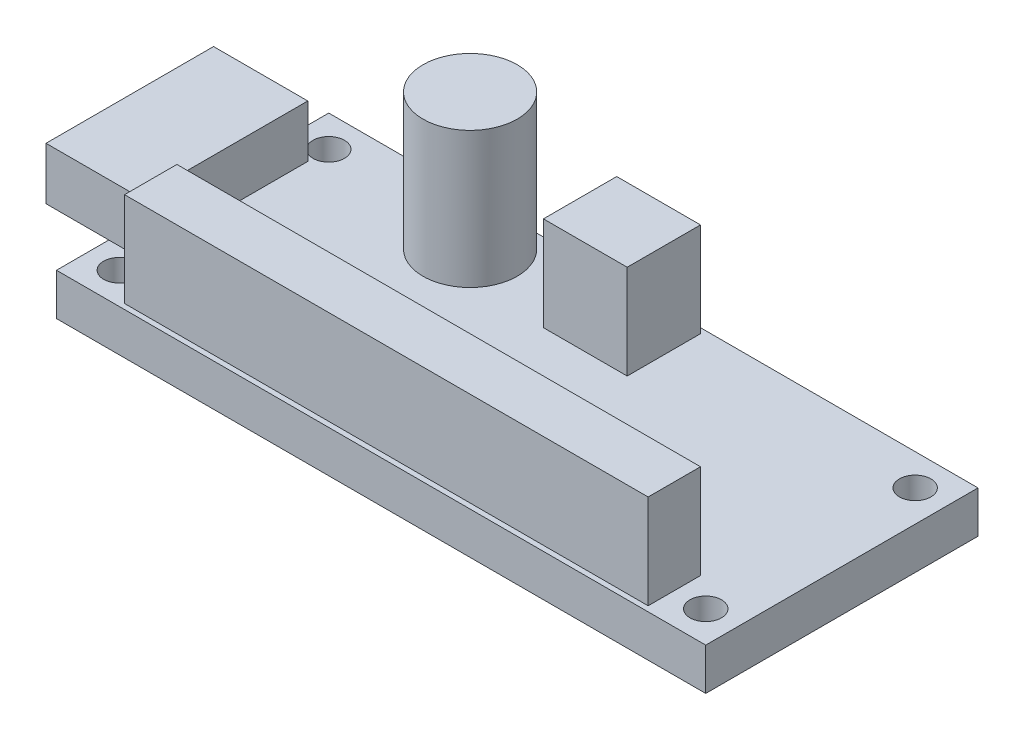
ISO-10303-21;
HEADER;
FILE_DESCRIPTION(('STEP AP214'),'2;1');
FILE_NAME('part.step','',(''),(''),'','','');
FILE_SCHEMA(('AUTOMOTIVE_DESIGN { 1 0 10303 214 1 1 1 1 }'));
ENDSEC;
DATA;
#1=APPLICATION_CONTEXT('core data for automotive mechanical design processes');
#2=APPLICATION_PROTOCOL_DEFINITION('international standard','automotive_design',2000,#1);
#3=PRODUCT_CONTEXT('',#1,'mechanical');
#4=PRODUCT('Part','Part','',(#3));
#5=PRODUCT_RELATED_PRODUCT_CATEGORY('part','',(#4));
#6=PRODUCT_DEFINITION_FORMATION('','',#4);
#7=PRODUCT_DEFINITION_CONTEXT('part definition',#1,'design');
#8=PRODUCT_DEFINITION('design','',#6,#7);
#9=PRODUCT_DEFINITION_SHAPE('','',#8);
#10=(LENGTH_UNIT() NAMED_UNIT(*) SI_UNIT(.MILLI.,.METRE.));
#11=(NAMED_UNIT(*) PLANE_ANGLE_UNIT() SI_UNIT($,.RADIAN.));
#12=(NAMED_UNIT(*) SI_UNIT($,.STERADIAN.) SOLID_ANGLE_UNIT());
#13=UNCERTAINTY_MEASURE_WITH_UNIT(LENGTH_MEASURE(1.E-05),#10,'distance_accuracy_value','');
#14=(GEOMETRIC_REPRESENTATION_CONTEXT(3) GLOBAL_UNCERTAINTY_ASSIGNED_CONTEXT((#13)) GLOBAL_UNIT_ASSIGNED_CONTEXT((#10,
#11,#12)) REPRESENTATION_CONTEXT('',''));
#15=CARTESIAN_POINT('',(0.,0.,0.));
#16=DIRECTION('',(0.,0.,1.));
#17=DIRECTION('',(1.,0.,0.));
#18=AXIS2_PLACEMENT_3D('',#15,#16,#17);
#19=CARTESIAN_POINT('',(0.,4.,0.));
#20=DIRECTION('',(0.,-1.,0.));
#21=DIRECTION('',(0.,0.,-1.));
#22=AXIS2_PLACEMENT_3D('',#19,#20,#21);
#23=PLANE('',#22);
#24=DIRECTION('',(0.,0.,1.));
#25=VECTOR('',#24,1.);
#26=CARTESIAN_POINT('',(28.,4.,-25.5));
#27=LINE('',#26,#25);
#28=CARTESIAN_POINT('',(28.,4.,-25.5));
#29=VERTEX_POINT('',#28);
#30=CARTESIAN_POINT('',(28.,4.,-18.5));
#31=VERTEX_POINT('',#30);
#32=EDGE_CURVE('E194',#29,#31,#27,.T.);
#33=ORIENTED_EDGE('',*,*,#32,.F.);
#34=DIRECTION('',(-1.,0.,0.));
#35=VECTOR('',#34,1.);
#36=CARTESIAN_POINT('',(28.,4.,-25.5));
#37=LINE('',#36,#35);
#38=CARTESIAN_POINT('',(36.,4.,-25.5));
#39=VERTEX_POINT('',#38);
#40=EDGE_CURVE('E210',#39,#29,#37,.T.);
#41=ORIENTED_EDGE('',*,*,#40,.F.);
#42=DIRECTION('',(0.,0.,-1.));
#43=VECTOR('',#42,1.);
#44=CARTESIAN_POINT('',(36.,4.,-25.5));
#45=LINE('',#44,#43);
#46=CARTESIAN_POINT('',(36.,4.,-18.5));
#47=VERTEX_POINT('',#46);
#48=EDGE_CURVE('E223',#47,#39,#45,.T.);
#49=ORIENTED_EDGE('',*,*,#48,.F.);
#50=DIRECTION('',(1.,0.,0.));
#51=VECTOR('',#50,1.);
#52=CARTESIAN_POINT('',(28.,4.,-18.5));
#53=LINE('',#52,#51);
#54=EDGE_CURVE('E199',#31,#47,#53,.T.);
#55=ORIENTED_EDGE('',*,*,#54,.F.);
#56=EDGE_LOOP('',(#33,#41,#49,#55));
#57=FACE_BOUND('',#56,.T.);
#58=CARTESIAN_POINT('',(3.,4.,-23.));
#59=DIRECTION('',(0.,1.,0.));
#60=DIRECTION('',(0.,0.,1.));
#61=AXIS2_PLACEMENT_3D('',#58,#59,#60);
#62=CIRCLE('',#61,1.5);
#63=CARTESIAN_POINT('',(3.,4.,-21.5));
#64=VERTEX_POINT('',#63);
#65=EDGE_CURVE('E303',#64,#64,#62,.T.);
#66=ORIENTED_EDGE('',*,*,#65,.F.);
#67=EDGE_LOOP('',(#66));
#68=FACE_BOUND('',#67,.T.);
#69=CARTESIAN_POINT('',(3.,4.,-2.99999999999999));
#70=DIRECTION('',(0.,1.,0.));
#71=DIRECTION('',(0.,0.,1.));
#72=AXIS2_PLACEMENT_3D('',#69,#70,#71);
#73=CIRCLE('',#72,1.5);
#74=CARTESIAN_POINT('',(3.,4.,-1.49999999999999));
#75=VERTEX_POINT('',#74);
#76=EDGE_CURVE('E299',#75,#75,#73,.T.);
#77=ORIENTED_EDGE('',*,*,#76,.F.);
#78=EDGE_LOOP('',(#77));
#79=FACE_BOUND('',#78,.T.);
#80=CARTESIAN_POINT('',(59.,4.,-3.));
#81=DIRECTION('',(0.,1.,0.));
#82=DIRECTION('',(0.,0.,1.));
#83=AXIS2_PLACEMENT_3D('',#80,#81,#82);
#84=CIRCLE('',#83,1.5);
#85=CARTESIAN_POINT('',(59.,4.,-1.5));
#86=VERTEX_POINT('',#85);
#87=EDGE_CURVE('E308',#86,#86,#84,.T.);
#88=ORIENTED_EDGE('',*,*,#87,.F.);
#89=EDGE_LOOP('',(#88));
#90=FACE_BOUND('',#89,.T.);
#91=CARTESIAN_POINT('',(59.,4.,-23.));
#92=DIRECTION('',(0.,1.,0.));
#93=DIRECTION('',(0.,0.,1.));
#94=AXIS2_PLACEMENT_3D('',#91,#92,#93);
#95=CIRCLE('',#94,1.5);
#96=CARTESIAN_POINT('',(59.,4.,-21.5));
#97=VERTEX_POINT('',#96);
#98=EDGE_CURVE('E316',#97,#97,#95,.T.);
#99=ORIENTED_EDGE('',*,*,#98,.F.);
#100=EDGE_LOOP('',(#99));
#101=FACE_BOUND('',#100,.T.);
#102=DIRECTION('',(0.,0.,1.));
#103=VECTOR('',#102,1.);
#104=CARTESIAN_POINT('',(6.,4.,-0.5));
#105=LINE('',#104,#103);
#106=CARTESIAN_POINT('',(6.,4.,-5.5));
#107=VERTEX_POINT('',#106);
#108=CARTESIAN_POINT('',(6.,4.,-0.5));
#109=VERTEX_POINT('',#108);
#110=EDGE_CURVE('E250',#107,#109,#105,.T.);
#111=ORIENTED_EDGE('',*,*,#110,.F.);
#112=DIRECTION('',(-1.,0.,0.));
#113=VECTOR('',#112,1.);
#114=CARTESIAN_POINT('',(6.,4.,-5.5));
#115=LINE('',#114,#113);
#116=CARTESIAN_POINT('',(56.,4.,-5.5));
#117=VERTEX_POINT('',#116);
#118=EDGE_CURVE('E259',#117,#107,#115,.T.);
#119=ORIENTED_EDGE('',*,*,#118,.F.);
#120=DIRECTION('',(0.,0.,-1.));
#121=VECTOR('',#120,1.);
#122=CARTESIAN_POINT('',(56.,4.,-0.5));
#123=LINE('',#122,#121);
#124=CARTESIAN_POINT('',(56.,4.,-0.5));
#125=VERTEX_POINT('',#124);
#126=EDGE_CURVE('E276',#125,#117,#123,.T.);
#127=ORIENTED_EDGE('',*,*,#126,.F.);
#128=DIRECTION('',(1.,0.,0.));
#129=VECTOR('',#128,1.);
#130=CARTESIAN_POINT('',(6.,4.,-0.5));
#131=LINE('',#130,#129);
#132=EDGE_CURVE('E272',#109,#125,#131,.T.);
#133=ORIENTED_EDGE('',*,*,#132,.F.);
#134=EDGE_LOOP('',(#111,#119,#127,#133));
#135=FACE_BOUND('',#134,.T.);
#136=DIRECTION('',(1.,0.,0.));
#137=VECTOR('',#136,1.);
#138=CARTESIAN_POINT('',(-6.,4.,-5.));
#139=LINE('',#138,#137);
#140=CARTESIAN_POINT('',(0.,4.,-5.));
#141=VERTEX_POINT('',#140);
#142=CARTESIAN_POINT('',(3.,4.,-5.));
#143=VERTEX_POINT('',#142);
#144=EDGE_CURVE('E412',#141,#143,#139,.T.);
#145=ORIENTED_EDGE('',*,*,#144,.F.);
#146=DIRECTION('',(0.,0.,1.));
#147=VECTOR('',#146,1.);
#148=CARTESIAN_POINT('',(0.,4.,0.));
#149=LINE('',#148,#147);
#150=CARTESIAN_POINT('',(0.,4.,0.));
#151=VERTEX_POINT('',#150);
#152=EDGE_CURVE('E336',#141,#151,#149,.T.);
#153=ORIENTED_EDGE('',*,*,#152,.T.);
#154=DIRECTION('',(1.,0.,0.));
#155=VECTOR('',#154,1.);
#156=CARTESIAN_POINT('',(0.,4.,0.));
#157=LINE('',#156,#155);
#158=CARTESIAN_POINT('',(62.,4.,0.));
#159=VERTEX_POINT('',#158);
#160=EDGE_CURVE('E334',#151,#159,#157,.T.);
#161=ORIENTED_EDGE('',*,*,#160,.T.);
#162=DIRECTION('',(0.,0.,-1.));
#163=VECTOR('',#162,1.);
#164=CARTESIAN_POINT('',(62.,4.,0.));
#165=LINE('',#164,#163);
#166=CARTESIAN_POINT('',(62.,4.,-26.));
#167=VERTEX_POINT('',#166);
#168=EDGE_CURVE('E339',#159,#167,#165,.T.);
#169=ORIENTED_EDGE('',*,*,#168,.T.);
#170=DIRECTION('',(-1.,0.,0.));
#171=VECTOR('',#170,1.);
#172=CARTESIAN_POINT('',(0.,4.,-26.));
#173=LINE('',#172,#171);
#174=CARTESIAN_POINT('',(18.,4.,-26.));
#175=VERTEX_POINT('',#174);
#176=EDGE_CURVE('E343',#167,#175,#173,.T.);
#177=ORIENTED_EDGE('',*,*,#176,.T.);
#178=CARTESIAN_POINT('',(18.,4.,-21.5));
#179=DIRECTION('',(0.,1.,0.));
#180=DIRECTION('',(0.,0.,1.));
#181=AXIS2_PLACEMENT_3D('',#178,#179,#180);
#182=CIRCLE('',#181,4.5);
#183=EDGE_CURVE('E245',#175,#175,#182,.T.);
#184=ORIENTED_EDGE('',*,*,#183,.F.);
#185=CARTESIAN_POINT('',(0.,4.,-26.));
#186=VERTEX_POINT('',#185);
#187=EDGE_CURVE('E342',#175,#186,#173,.T.);
#188=ORIENTED_EDGE('',*,*,#187,.T.);
#189=CARTESIAN_POINT('',(0.,4.,-21.));
#190=VERTEX_POINT('',#189);
#191=EDGE_CURVE('E331',#186,#190,#149,.T.);
#192=ORIENTED_EDGE('',*,*,#191,.T.);
#193=DIRECTION('',(-1.,0.,0.));
#194=VECTOR('',#193,1.);
#195=CARTESIAN_POINT('',(-6.,4.,-21.));
#196=LINE('',#195,#194);
#197=CARTESIAN_POINT('',(3.,4.,-21.));
#198=VERTEX_POINT('',#197);
#199=EDGE_CURVE('E64',#198,#190,#196,.T.);
#200=ORIENTED_EDGE('',*,*,#199,.F.);
#201=DIRECTION('',(0.,0.,-1.));
#202=VECTOR('',#201,1.);
#203=CARTESIAN_POINT('',(3.,4.,-21.));
#204=LINE('',#203,#202);
#205=EDGE_CURVE('E59',#143,#198,#204,.T.);
#206=ORIENTED_EDGE('',*,*,#205,.F.);
#207=EDGE_LOOP('',(#145,#153,#161,#169,#177,#184,#188,#192,#200,#206));
#208=FACE_BOUND('',#207,.T.);
#209=ADVANCED_FACE('F43',(#57,#68,#79,#90,#101,#135,#208),#23,.F.);
#210=CARTESIAN_POINT('',(0.,4.,0.));
#211=DIRECTION('',(1.,0.,0.));
#212=DIRECTION('',(0.,0.,-1.));
#213=AXIS2_PLACEMENT_3D('',#210,#211,#212);
#214=PLANE('',#213);
#215=DIRECTION('',(0.,0.,1.));
#216=VECTOR('',#215,1.);
#217=CARTESIAN_POINT('',(0.,0.,0.));
#218=LINE('',#217,#216);
#219=CARTESIAN_POINT('',(0.,0.,-26.));
#220=VERTEX_POINT('',#219);
#221=CARTESIAN_POINT('',(0.,0.,0.));
#222=VERTEX_POINT('',#221);
#223=EDGE_CURVE('E327',#220,#222,#218,.T.);
#224=ORIENTED_EDGE('',*,*,#223,.T.);
#225=DIRECTION('',(0.,-1.,0.));
#226=VECTOR('',#225,1.);
#227=CARTESIAN_POINT('',(0.,4.,0.));
#228=LINE('',#227,#226);
#229=EDGE_CURVE('E11',#151,#222,#228,.T.);
#230=ORIENTED_EDGE('',*,*,#229,.F.);
#231=ORIENTED_EDGE('',*,*,#152,.F.);
#232=EDGE_CURVE('E335',#190,#141,#149,.T.);
#233=ORIENTED_EDGE('',*,*,#232,.F.);
#234=ORIENTED_EDGE('',*,*,#191,.F.);
#235=DIRECTION('',(0.,-1.,0.));
#236=VECTOR('',#235,1.);
#237=CARTESIAN_POINT('',(0.,4.,-26.));
#238=LINE('',#237,#236);
#239=EDGE_CURVE('E346',#186,#220,#238,.T.);
#240=ORIENTED_EDGE('',*,*,#239,.T.);
#241=EDGE_LOOP('',(#224,#230,#231,#233,#234,#240));
#242=FACE_BOUND('',#241,.T.);
#243=ADVANCED_FACE('F45',(#242),#214,.F.);
#244=CARTESIAN_POINT('',(0.,4.,0.));
#245=DIRECTION('',(0.,0.,-1.));
#246=DIRECTION('',(-1.,0.,0.));
#247=AXIS2_PLACEMENT_3D('',#244,#245,#246);
#248=PLANE('',#247);
#249=DIRECTION('',(1.,0.,0.));
#250=VECTOR('',#249,1.);
#251=CARTESIAN_POINT('',(0.,0.,0.));
#252=LINE('',#251,#250);
#253=CARTESIAN_POINT('',(62.,0.,0.));
#254=VERTEX_POINT('',#253);
#255=EDGE_CURVE('E350',#222,#254,#252,.T.);
#256=ORIENTED_EDGE('',*,*,#255,.T.);
#257=DIRECTION('',(0.,-1.,0.));
#258=VECTOR('',#257,1.);
#259=CARTESIAN_POINT('',(62.,4.,0.));
#260=LINE('',#259,#258);
#261=EDGE_CURVE('E52',#159,#254,#260,.T.);
#262=ORIENTED_EDGE('',*,*,#261,.F.);
#263=ORIENTED_EDGE('',*,*,#160,.F.);
#264=ORIENTED_EDGE('',*,*,#229,.T.);
#265=EDGE_LOOP('',(#256,#262,#263,#264));
#266=FACE_BOUND('',#265,.T.);
#267=ADVANCED_FACE('F433',(#266),#248,.F.);
#268=CARTESIAN_POINT('',(62.,4.,0.));
#269=DIRECTION('',(-1.,0.,0.));
#270=DIRECTION('',(0.,0.,1.));
#271=AXIS2_PLACEMENT_3D('',#268,#269,#270);
#272=PLANE('',#271);
#273=DIRECTION('',(0.,0.,-1.));
#274=VECTOR('',#273,1.);
#275=CARTESIAN_POINT('',(62.,0.,0.));
#276=LINE('',#275,#274);
#277=CARTESIAN_POINT('',(62.,0.,-26.));
#278=VERTEX_POINT('',#277);
#279=EDGE_CURVE('E353',#254,#278,#276,.T.);
#280=ORIENTED_EDGE('',*,*,#279,.T.);
#281=DIRECTION('',(0.,-1.,0.));
#282=VECTOR('',#281,1.);
#283=CARTESIAN_POINT('',(62.,4.,-26.));
#284=LINE('',#283,#282);
#285=EDGE_CURVE('E362',#167,#278,#284,.T.);
#286=ORIENTED_EDGE('',*,*,#285,.F.);
#287=ORIENTED_EDGE('',*,*,#168,.F.);
#288=ORIENTED_EDGE('',*,*,#261,.T.);
#289=EDGE_LOOP('',(#280,#286,#287,#288));
#290=FACE_BOUND('',#289,.T.);
#291=ADVANCED_FACE('F371',(#290),#272,.F.);
#292=CARTESIAN_POINT('',(0.,4.,-26.));
#293=DIRECTION('',(0.,0.,1.));
#294=DIRECTION('',(1.,0.,0.));
#295=AXIS2_PLACEMENT_3D('',#292,#293,#294);
#296=PLANE('',#295);
#297=DIRECTION('',(-1.,0.,0.));
#298=VECTOR('',#297,1.);
#299=CARTESIAN_POINT('',(0.,0.,-26.));
#300=LINE('',#299,#298);
#301=EDGE_CURVE('E356',#278,#220,#300,.T.);
#302=ORIENTED_EDGE('',*,*,#301,.T.);
#303=ORIENTED_EDGE('',*,*,#239,.F.);
#304=ORIENTED_EDGE('',*,*,#187,.F.);
#305=ORIENTED_EDGE('',*,*,#176,.F.);
#306=ORIENTED_EDGE('',*,*,#285,.T.);
#307=EDGE_LOOP('',(#302,#303,#304,#305,#306));
#308=FACE_BOUND('',#307,.T.);
#309=ADVANCED_FACE('F381',(#308),#296,.F.);
#310=CARTESIAN_POINT('',(0.,0.,0.));
#311=DIRECTION('',(0.,-1.,0.));
#312=DIRECTION('',(0.,0.,-1.));
#313=AXIS2_PLACEMENT_3D('',#310,#311,#312);
#314=PLANE('',#313);
#315=CARTESIAN_POINT('',(59.,0.,-23.));
#316=DIRECTION('',(0.,1.,0.));
#317=DIRECTION('',(0.,0.,1.));
#318=AXIS2_PLACEMENT_3D('',#315,#316,#317);
#319=CIRCLE('',#318,1.5);
#320=CARTESIAN_POINT('',(59.,0.,-21.5));
#321=VERTEX_POINT('',#320);
#322=EDGE_CURVE('E298',#321,#321,#319,.T.);
#323=ORIENTED_EDGE('',*,*,#322,.T.);
#324=EDGE_LOOP('',(#323));
#325=FACE_BOUND('',#324,.T.);
#326=CARTESIAN_POINT('',(59.,0.,-3.));
#327=DIRECTION('',(0.,1.,0.));
#328=DIRECTION('',(0.,0.,1.));
#329=AXIS2_PLACEMENT_3D('',#326,#327,#328);
#330=CIRCLE('',#329,1.5);
#331=CARTESIAN_POINT('',(59.,0.,-1.5));
#332=VERTEX_POINT('',#331);
#333=EDGE_CURVE('E312',#332,#332,#330,.T.);
#334=ORIENTED_EDGE('',*,*,#333,.T.);
#335=EDGE_LOOP('',(#334));
#336=FACE_BOUND('',#335,.T.);
#337=CARTESIAN_POINT('',(3.,0.,-2.99999999999999));
#338=DIRECTION('',(0.,1.,0.));
#339=DIRECTION('',(0.,0.,1.));
#340=AXIS2_PLACEMENT_3D('',#337,#338,#339);
#341=CIRCLE('',#340,1.5);
#342=CARTESIAN_POINT('',(3.,0.,-1.49999999999999));
#343=VERTEX_POINT('',#342);
#344=EDGE_CURVE('E304',#343,#343,#341,.T.);
#345=ORIENTED_EDGE('',*,*,#344,.T.);
#346=EDGE_LOOP('',(#345));
#347=FACE_BOUND('',#346,.T.);
#348=CARTESIAN_POINT('',(3.,0.,-23.));
#349=DIRECTION('',(0.,1.,0.));
#350=DIRECTION('',(0.,0.,1.));
#351=AXIS2_PLACEMENT_3D('',#348,#349,#350);
#352=CIRCLE('',#351,1.5);
#353=CARTESIAN_POINT('',(3.,0.,-21.5));
#354=VERTEX_POINT('',#353);
#355=EDGE_CURVE('E323',#354,#354,#352,.T.);
#356=ORIENTED_EDGE('',*,*,#355,.T.);
#357=EDGE_LOOP('',(#356));
#358=FACE_BOUND('',#357,.T.);
#359=ORIENTED_EDGE('',*,*,#223,.F.);
#360=ORIENTED_EDGE('',*,*,#301,.F.);
#361=ORIENTED_EDGE('',*,*,#279,.F.);
#362=ORIENTED_EDGE('',*,*,#255,.F.);
#363=EDGE_LOOP('',(#359,#360,#361,#362));
#364=FACE_BOUND('',#363,.T.);
#365=ADVANCED_FACE('F378',(#325,#336,#347,#358,#364),#314,.T.);
#366=CARTESIAN_POINT('',(3.,0.,-23.));
#367=DIRECTION('',(0.,1.,0.));
#368=DIRECTION('',(0.,0.,1.));
#369=AXIS2_PLACEMENT_3D('',#366,#367,#368);
#370=CYLINDRICAL_SURFACE('',#369,1.5);
#371=ORIENTED_EDGE('',*,*,#355,.F.);
#372=EDGE_LOOP('',(#371));
#373=FACE_BOUND('',#372,.T.);
#374=ORIENTED_EDGE('',*,*,#65,.T.);
#375=EDGE_LOOP('',(#374));
#376=FACE_BOUND('',#375,.T.);
#377=ADVANCED_FACE('F437',(#373,#376),#370,.F.);
#378=CARTESIAN_POINT('',(3.,0.,-2.99999999999999));
#379=DIRECTION('',(0.,1.,0.));
#380=DIRECTION('',(0.,0.,1.));
#381=AXIS2_PLACEMENT_3D('',#378,#379,#380);
#382=CYLINDRICAL_SURFACE('',#381,1.5);
#383=ORIENTED_EDGE('',*,*,#344,.F.);
#384=EDGE_LOOP('',(#383));
#385=FACE_BOUND('',#384,.T.);
#386=ORIENTED_EDGE('',*,*,#76,.T.);
#387=EDGE_LOOP('',(#386));
#388=FACE_BOUND('',#387,.T.);
#389=ADVANCED_FACE('F487',(#385,#388),#382,.F.);
#390=CARTESIAN_POINT('',(59.,0.,-3.));
#391=DIRECTION('',(0.,1.,0.));
#392=DIRECTION('',(0.,0.,1.));
#393=AXIS2_PLACEMENT_3D('',#390,#391,#392);
#394=CYLINDRICAL_SURFACE('',#393,1.5);
#395=ORIENTED_EDGE('',*,*,#333,.F.);
#396=EDGE_LOOP('',(#395));
#397=FACE_BOUND('',#396,.T.);
#398=ORIENTED_EDGE('',*,*,#87,.T.);
#399=EDGE_LOOP('',(#398));
#400=FACE_BOUND('',#399,.T.);
#401=ADVANCED_FACE('F490',(#397,#400),#394,.F.);
#402=CARTESIAN_POINT('',(59.,0.,-23.));
#403=DIRECTION('',(0.,1.,0.));
#404=DIRECTION('',(0.,0.,1.));
#405=AXIS2_PLACEMENT_3D('',#402,#403,#404);
#406=CYLINDRICAL_SURFACE('',#405,1.5);
#407=ORIENTED_EDGE('',*,*,#322,.F.);
#408=EDGE_LOOP('',(#407));
#409=FACE_BOUND('',#408,.T.);
#410=ORIENTED_EDGE('',*,*,#98,.T.);
#411=EDGE_LOOP('',(#410));
#412=FACE_BOUND('',#411,.T.);
#413=ADVANCED_FACE('F485',(#409,#412),#406,.F.);
#414=CARTESIAN_POINT('',(6.,13.,-0.5));
#415=DIRECTION('',(1.,0.,0.));
#416=DIRECTION('',(0.,0.,-1.));
#417=AXIS2_PLACEMENT_3D('',#414,#415,#416);
#418=PLANE('',#417);
#419=ORIENTED_EDGE('',*,*,#110,.T.);
#420=DIRECTION('',(0.,-1.,0.));
#421=VECTOR('',#420,1.);
#422=CARTESIAN_POINT('',(6.,13.,-0.5));
#423=LINE('',#422,#421);
#424=CARTESIAN_POINT('',(6.,13.,-0.5));
#425=VERTEX_POINT('',#424);
#426=EDGE_CURVE('E294',#425,#109,#423,.T.);
#427=ORIENTED_EDGE('',*,*,#426,.F.);
#428=DIRECTION('',(0.,0.,1.));
#429=VECTOR('',#428,1.);
#430=CARTESIAN_POINT('',(6.,13.,-0.5));
#431=LINE('',#430,#429);
#432=CARTESIAN_POINT('',(6.,13.,-5.5));
#433=VERTEX_POINT('',#432);
#434=EDGE_CURVE('E254',#433,#425,#431,.T.);
#435=ORIENTED_EDGE('',*,*,#434,.F.);
#436=DIRECTION('',(0.,-1.,0.));
#437=VECTOR('',#436,1.);
#438=CARTESIAN_POINT('',(6.,13.,-5.5));
#439=LINE('',#438,#437);
#440=EDGE_CURVE('E268',#433,#107,#439,.T.);
#441=ORIENTED_EDGE('',*,*,#440,.T.);
#442=EDGE_LOOP('',(#419,#427,#435,#441));
#443=FACE_BOUND('',#442,.T.);
#444=ADVANCED_FACE('F481',(#443),#418,.F.);
#445=CARTESIAN_POINT('',(6.,13.,-0.5));
#446=DIRECTION('',(0.,0.,-1.));
#447=DIRECTION('',(-1.,0.,0.));
#448=AXIS2_PLACEMENT_3D('',#445,#446,#447);
#449=PLANE('',#448);
#450=ORIENTED_EDGE('',*,*,#132,.T.);
#451=DIRECTION('',(0.,-1.,0.));
#452=VECTOR('',#451,1.);
#453=CARTESIAN_POINT('',(56.,13.,-0.5));
#454=LINE('',#453,#452);
#455=CARTESIAN_POINT('',(56.,13.,-0.5));
#456=VERTEX_POINT('',#455);
#457=EDGE_CURVE('E290',#456,#125,#454,.T.);
#458=ORIENTED_EDGE('',*,*,#457,.F.);
#459=DIRECTION('',(1.,0.,0.));
#460=VECTOR('',#459,1.);
#461=CARTESIAN_POINT('',(6.,13.,-0.5));
#462=LINE('',#461,#460);
#463=EDGE_CURVE('E258',#425,#456,#462,.T.);
#464=ORIENTED_EDGE('',*,*,#463,.F.);
#465=ORIENTED_EDGE('',*,*,#426,.T.);
#466=EDGE_LOOP('',(#450,#458,#464,#465));
#467=FACE_BOUND('',#466,.T.);
#468=ADVANCED_FACE('F477',(#467),#449,.F.);
#469=CARTESIAN_POINT('',(56.,13.,-0.5));
#470=DIRECTION('',(-1.,0.,0.));
#471=DIRECTION('',(0.,0.,1.));
#472=AXIS2_PLACEMENT_3D('',#469,#470,#471);
#473=PLANE('',#472);
#474=ORIENTED_EDGE('',*,*,#126,.T.);
#475=DIRECTION('',(0.,-1.,0.));
#476=VECTOR('',#475,1.);
#477=CARTESIAN_POINT('',(56.,13.,-5.5));
#478=LINE('',#477,#476);
#479=CARTESIAN_POINT('',(56.,13.,-5.5));
#480=VERTEX_POINT('',#479);
#481=EDGE_CURVE('E286',#480,#117,#478,.T.);
#482=ORIENTED_EDGE('',*,*,#481,.F.);
#483=DIRECTION('',(0.,0.,-1.));
#484=VECTOR('',#483,1.);
#485=CARTESIAN_POINT('',(56.,13.,-0.5));
#486=LINE('',#485,#484);
#487=EDGE_CURVE('E262',#456,#480,#486,.T.);
#488=ORIENTED_EDGE('',*,*,#487,.F.);
#489=ORIENTED_EDGE('',*,*,#457,.T.);
#490=EDGE_LOOP('',(#474,#482,#488,#489));
#491=FACE_BOUND('',#490,.T.);
#492=ADVANCED_FACE('F473',(#491),#473,.F.);
#493=CARTESIAN_POINT('',(6.,13.,-5.5));
#494=DIRECTION('',(0.,0.,1.));
#495=DIRECTION('',(1.,0.,0.));
#496=AXIS2_PLACEMENT_3D('',#493,#494,#495);
#497=PLANE('',#496);
#498=ORIENTED_EDGE('',*,*,#118,.T.);
#499=ORIENTED_EDGE('',*,*,#440,.F.);
#500=DIRECTION('',(-1.,0.,0.));
#501=VECTOR('',#500,1.);
#502=CARTESIAN_POINT('',(6.,13.,-5.5));
#503=LINE('',#502,#501);
#504=EDGE_CURVE('E265',#480,#433,#503,.T.);
#505=ORIENTED_EDGE('',*,*,#504,.F.);
#506=ORIENTED_EDGE('',*,*,#481,.T.);
#507=EDGE_LOOP('',(#498,#499,#505,#506));
#508=FACE_BOUND('',#507,.T.);
#509=ADVANCED_FACE('F465',(#508),#497,.F.);
#510=CARTESIAN_POINT('',(0.,13.,0.));
#511=DIRECTION('',(0.,-1.,0.));
#512=DIRECTION('',(0.,0.,-1.));
#513=AXIS2_PLACEMENT_3D('',#510,#511,#512);
#514=PLANE('',#513);
#515=ORIENTED_EDGE('',*,*,#434,.T.);
#516=ORIENTED_EDGE('',*,*,#463,.T.);
#517=ORIENTED_EDGE('',*,*,#487,.T.);
#518=ORIENTED_EDGE('',*,*,#504,.T.);
#519=EDGE_LOOP('',(#515,#516,#517,#518));
#520=FACE_BOUND('',#519,.T.);
#521=ADVANCED_FACE('F455',(#520),#514,.F.);
#522=CARTESIAN_POINT('',(18.,17.,-21.5));
#523=DIRECTION('',(0.,-1.,0.));
#524=DIRECTION('',(0.,0.,-1.));
#525=AXIS2_PLACEMENT_3D('',#522,#523,#524);
#526=CYLINDRICAL_SURFACE('',#525,4.5);
#527=CARTESIAN_POINT('',(18.,17.,-21.5));
#528=DIRECTION('',(0.,1.,0.));
#529=DIRECTION('',(0.,0.,1.));
#530=AXIS2_PLACEMENT_3D('',#527,#528,#529);
#531=CIRCLE('',#530,4.5);
#532=CARTESIAN_POINT('',(18.,17.,-17.));
#533=VERTEX_POINT('',#532);
#534=EDGE_CURVE('E246',#533,#533,#531,.T.);
#535=ORIENTED_EDGE('',*,*,#534,.F.);
#536=EDGE_LOOP('',(#535));
#537=FACE_BOUND('',#536,.T.);
#538=ORIENTED_EDGE('',*,*,#183,.T.);
#539=EDGE_LOOP('',(#538));
#540=FACE_BOUND('',#539,.T.);
#541=ADVANCED_FACE('F452',(#537,#540),#526,.T.);
#542=CARTESIAN_POINT('',(18.,17.,-21.5));
#543=DIRECTION('',(0.,1.,0.));
#544=DIRECTION('',(0.,0.,1.));
#545=AXIS2_PLACEMENT_3D('',#542,#543,#544);
#546=PLANE('',#545);
#547=ORIENTED_EDGE('',*,*,#534,.T.);
#548=EDGE_LOOP('',(#547));
#549=FACE_BOUND('',#548,.T.);
#550=ADVANCED_FACE('F454',(#549),#546,.T.);
#551=CARTESIAN_POINT('',(28.,13.,-25.5));
#552=DIRECTION('',(1.,0.,0.));
#553=DIRECTION('',(0.,0.,-1.));
#554=AXIS2_PLACEMENT_3D('',#551,#552,#553);
#555=PLANE('',#554);
#556=ORIENTED_EDGE('',*,*,#32,.T.);
#557=DIRECTION('',(0.,-1.,0.));
#558=VECTOR('',#557,1.);
#559=CARTESIAN_POINT('',(28.,13.,-18.5));
#560=LINE('',#559,#558);
#561=CARTESIAN_POINT('',(28.,13.,-18.5));
#562=VERTEX_POINT('',#561);
#563=EDGE_CURVE('E241',#562,#31,#560,.T.);
#564=ORIENTED_EDGE('',*,*,#563,.F.);
#565=DIRECTION('',(0.,0.,1.));
#566=VECTOR('',#565,1.);
#567=CARTESIAN_POINT('',(28.,13.,-25.5));
#568=LINE('',#567,#566);
#569=CARTESIAN_POINT('',(28.,13.,-25.5));
#570=VERTEX_POINT('',#569);
#571=EDGE_CURVE('E205',#570,#562,#568,.T.);
#572=ORIENTED_EDGE('',*,*,#571,.F.);
#573=DIRECTION('',(0.,-1.,0.));
#574=VECTOR('',#573,1.);
#575=CARTESIAN_POINT('',(28.,13.,-25.5));
#576=LINE('',#575,#574);
#577=EDGE_CURVE('E218',#570,#29,#576,.T.);
#578=ORIENTED_EDGE('',*,*,#577,.T.);
#579=EDGE_LOOP('',(#556,#564,#572,#578));
#580=FACE_BOUND('',#579,.T.);
#581=ADVANCED_FACE('F462',(#580),#555,.F.);
#582=CARTESIAN_POINT('',(28.,13.,-18.5));
#583=DIRECTION('',(0.,0.,-1.));
#584=DIRECTION('',(-1.,0.,0.));
#585=AXIS2_PLACEMENT_3D('',#582,#583,#584);
#586=PLANE('',#585);
#587=ORIENTED_EDGE('',*,*,#54,.T.);
#588=DIRECTION('',(0.,-1.,0.));
#589=VECTOR('',#588,1.);
#590=CARTESIAN_POINT('',(36.,13.,-18.5));
#591=LINE('',#590,#589);
#592=CARTESIAN_POINT('',(36.,13.,-18.5));
#593=VERTEX_POINT('',#592);
#594=EDGE_CURVE('E237',#593,#47,#591,.T.);
#595=ORIENTED_EDGE('',*,*,#594,.F.);
#596=DIRECTION('',(1.,0.,0.));
#597=VECTOR('',#596,1.);
#598=CARTESIAN_POINT('',(28.,13.,-18.5));
#599=LINE('',#598,#597);
#600=EDGE_CURVE('E209',#562,#593,#599,.T.);
#601=ORIENTED_EDGE('',*,*,#600,.F.);
#602=ORIENTED_EDGE('',*,*,#563,.T.);
#603=EDGE_LOOP('',(#587,#595,#601,#602));
#604=FACE_BOUND('',#603,.T.);
#605=ADVANCED_FACE('F609',(#604),#586,.F.);
#606=CARTESIAN_POINT('',(36.,13.,-25.5));
#607=DIRECTION('',(-1.,0.,0.));
#608=DIRECTION('',(0.,0.,1.));
#609=AXIS2_PLACEMENT_3D('',#606,#607,#608);
#610=PLANE('',#609);
#611=ORIENTED_EDGE('',*,*,#48,.T.);
#612=DIRECTION('',(0.,-1.,0.));
#613=VECTOR('',#612,1.);
#614=CARTESIAN_POINT('',(36.,13.,-25.5));
#615=LINE('',#614,#613);
#616=CARTESIAN_POINT('',(36.,13.,-25.5));
#617=VERTEX_POINT('',#616);
#618=EDGE_CURVE('E233',#617,#39,#615,.T.);
#619=ORIENTED_EDGE('',*,*,#618,.F.);
#620=DIRECTION('',(0.,0.,-1.));
#621=VECTOR('',#620,1.);
#622=CARTESIAN_POINT('',(36.,13.,-25.5));
#623=LINE('',#622,#621);
#624=EDGE_CURVE('E213',#593,#617,#623,.T.);
#625=ORIENTED_EDGE('',*,*,#624,.F.);
#626=ORIENTED_EDGE('',*,*,#594,.T.);
#627=EDGE_LOOP('',(#611,#619,#625,#626));
#628=FACE_BOUND('',#627,.T.);
#629=ADVANCED_FACE('F619',(#628),#610,.F.);
#630=CARTESIAN_POINT('',(28.,13.,-25.5));
#631=DIRECTION('',(0.,0.,1.));
#632=DIRECTION('',(1.,0.,0.));
#633=AXIS2_PLACEMENT_3D('',#630,#631,#632);
#634=PLANE('',#633);
#635=ORIENTED_EDGE('',*,*,#40,.T.);
#636=ORIENTED_EDGE('',*,*,#577,.F.);
#637=DIRECTION('',(-1.,0.,0.));
#638=VECTOR('',#637,1.);
#639=CARTESIAN_POINT('',(28.,13.,-25.5));
#640=LINE('',#639,#638);
#641=EDGE_CURVE('E216',#617,#570,#640,.T.);
#642=ORIENTED_EDGE('',*,*,#641,.F.);
#643=ORIENTED_EDGE('',*,*,#618,.T.);
#644=EDGE_LOOP('',(#635,#636,#642,#643));
#645=FACE_BOUND('',#644,.T.);
#646=ADVANCED_FACE('F630',(#645),#634,.F.);
#647=CARTESIAN_POINT('',(0.,13.,0.));
#648=DIRECTION('',(0.,1.,0.));
#649=DIRECTION('',(0.,0.,1.));
#650=AXIS2_PLACEMENT_3D('',#647,#648,#649);
#651=PLANE('',#650);
#652=ORIENTED_EDGE('',*,*,#571,.T.);
#653=ORIENTED_EDGE('',*,*,#600,.T.);
#654=ORIENTED_EDGE('',*,*,#624,.T.);
#655=ORIENTED_EDGE('',*,*,#641,.T.);
#656=EDGE_LOOP('',(#652,#653,#654,#655));
#657=FACE_BOUND('',#656,.T.);
#658=ADVANCED_FACE('F641',(#657),#651,.T.);
#659=CARTESIAN_POINT('',(0.,4.,0.));
#660=DIRECTION('',(0.,1.,0.));
#661=DIRECTION('',(0.,0.,1.));
#662=AXIS2_PLACEMENT_3D('',#659,#660,#661);
#663=PLANE('',#662);
#664=CARTESIAN_POINT('',(-6.,4.,-21.));
#665=VERTEX_POINT('',#664);
#666=EDGE_CURVE('E391',#190,#665,#196,.T.);
#667=ORIENTED_EDGE('',*,*,#666,.F.);
#668=ORIENTED_EDGE('',*,*,#232,.T.);
#669=CARTESIAN_POINT('',(-6.,4.,-5.));
#670=VERTEX_POINT('',#669);
#671=EDGE_CURVE('E413',#670,#141,#139,.T.);
#672=ORIENTED_EDGE('',*,*,#671,.F.);
#673=DIRECTION('',(0.,0.,1.));
#674=VECTOR('',#673,1.);
#675=CARTESIAN_POINT('',(-6.,4.,-21.));
#676=LINE('',#675,#674);
#677=EDGE_CURVE('E192',#665,#670,#676,.T.);
#678=ORIENTED_EDGE('',*,*,#677,.F.);
#679=EDGE_LOOP('',(#667,#668,#672,#678));
#680=FACE_BOUND('',#679,.T.);
#681=ADVANCED_FACE('F392',(#680),#663,.F.);
#682=CARTESIAN_POINT('',(-6.,9.,-21.));
#683=DIRECTION('',(1.,0.,0.));
#684=DIRECTION('',(0.,0.,-1.));
#685=AXIS2_PLACEMENT_3D('',#682,#683,#684);
#686=PLANE('',#685);
#687=ORIENTED_EDGE('',*,*,#677,.T.);
#688=DIRECTION('',(0.,-1.,0.));
#689=VECTOR('',#688,1.);
#690=CARTESIAN_POINT('',(-6.,9.,-5.));
#691=LINE('',#690,#689);
#692=CARTESIAN_POINT('',(-6.,9.,-5.));
#693=VERTEX_POINT('',#692);
#694=EDGE_CURVE('E171',#693,#670,#691,.T.);
#695=ORIENTED_EDGE('',*,*,#694,.F.);
#696=DIRECTION('',(0.,0.,1.));
#697=VECTOR('',#696,1.);
#698=CARTESIAN_POINT('',(-6.,9.,-21.));
#699=LINE('',#698,#697);
#700=CARTESIAN_POINT('',(-6.,9.,-21.));
#701=VERTEX_POINT('',#700);
#702=EDGE_CURVE('E179',#701,#693,#699,.T.);
#703=ORIENTED_EDGE('',*,*,#702,.F.);
#704=DIRECTION('',(0.,-1.,0.));
#705=VECTOR('',#704,1.);
#706=CARTESIAN_POINT('',(-6.,9.,-21.));
#707=LINE('',#706,#705);
#708=EDGE_CURVE('E403',#701,#665,#707,.T.);
#709=ORIENTED_EDGE('',*,*,#708,.T.);
#710=EDGE_LOOP('',(#687,#695,#703,#709));
#711=FACE_BOUND('',#710,.T.);
#712=ADVANCED_FACE('F190',(#711),#686,.F.);
#713=CARTESIAN_POINT('',(-6.,9.,-5.));
#714=DIRECTION('',(0.,0.,-1.));
#715=DIRECTION('',(-1.,0.,0.));
#716=AXIS2_PLACEMENT_3D('',#713,#714,#715);
#717=PLANE('',#716);
#718=ORIENTED_EDGE('',*,*,#671,.T.);
#719=ORIENTED_EDGE('',*,*,#144,.T.);
#720=DIRECTION('',(0.,-1.,0.));
#721=VECTOR('',#720,1.);
#722=CARTESIAN_POINT('',(3.,9.,-5.));
#723=LINE('',#722,#721);
#724=CARTESIAN_POINT('',(3.,9.,-5.));
#725=VERTEX_POINT('',#724);
#726=EDGE_CURVE('E174',#725,#143,#723,.T.);
#727=ORIENTED_EDGE('',*,*,#726,.F.);
#728=DIRECTION('',(1.,0.,0.));
#729=VECTOR('',#728,1.);
#730=CARTESIAN_POINT('',(-6.,9.,-5.));
#731=LINE('',#730,#729);
#732=EDGE_CURVE('E166',#693,#725,#731,.T.);
#733=ORIENTED_EDGE('',*,*,#732,.F.);
#734=ORIENTED_EDGE('',*,*,#694,.T.);
#735=EDGE_LOOP('',(#718,#719,#727,#733,#734));
#736=FACE_BOUND('',#735,.T.);
#737=ADVANCED_FACE('F169',(#736),#717,.F.);
#738=CARTESIAN_POINT('',(3.,9.,-21.));
#739=DIRECTION('',(-1.,0.,0.));
#740=DIRECTION('',(0.,0.,1.));
#741=AXIS2_PLACEMENT_3D('',#738,#739,#740);
#742=PLANE('',#741);
#743=ORIENTED_EDGE('',*,*,#205,.T.);
#744=DIRECTION('',(0.,-1.,0.));
#745=VECTOR('',#744,1.);
#746=CARTESIAN_POINT('',(3.,9.,-21.));
#747=LINE('',#746,#745);
#748=CARTESIAN_POINT('',(3.,9.,-21.));
#749=VERTEX_POINT('',#748);
#750=EDGE_CURVE('E201',#749,#198,#747,.T.);
#751=ORIENTED_EDGE('',*,*,#750,.F.);
#752=DIRECTION('',(0.,0.,-1.));
#753=VECTOR('',#752,1.);
#754=CARTESIAN_POINT('',(3.,9.,-21.));
#755=LINE('',#754,#753);
#756=EDGE_CURVE('E178',#725,#749,#755,.T.);
#757=ORIENTED_EDGE('',*,*,#756,.F.);
#758=ORIENTED_EDGE('',*,*,#726,.T.);
#759=EDGE_LOOP('',(#743,#751,#757,#758));
#760=FACE_BOUND('',#759,.T.);
#761=ADVANCED_FACE('F418',(#760),#742,.F.);
#762=CARTESIAN_POINT('',(-6.,9.,-21.));
#763=DIRECTION('',(0.,0.,1.));
#764=DIRECTION('',(1.,0.,0.));
#765=AXIS2_PLACEMENT_3D('',#762,#763,#764);
#766=PLANE('',#765);
#767=ORIENTED_EDGE('',*,*,#199,.T.);
#768=ORIENTED_EDGE('',*,*,#666,.T.);
#769=ORIENTED_EDGE('',*,*,#708,.F.);
#770=DIRECTION('',(-1.,0.,0.));
#771=VECTOR('',#770,1.);
#772=CARTESIAN_POINT('',(-6.,9.,-21.));
#773=LINE('',#772,#771);
#774=EDGE_CURVE('E184',#749,#701,#773,.T.);
#775=ORIENTED_EDGE('',*,*,#774,.F.);
#776=ORIENTED_EDGE('',*,*,#750,.T.);
#777=EDGE_LOOP('',(#767,#768,#769,#775,#776));
#778=FACE_BOUND('',#777,.T.);
#779=ADVANCED_FACE('F397',(#778),#766,.F.);
#780=CARTESIAN_POINT('',(0.,9.,0.));
#781=DIRECTION('',(0.,1.,0.));
#782=DIRECTION('',(0.,0.,1.));
#783=AXIS2_PLACEMENT_3D('',#780,#781,#782);
#784=PLANE('',#783);
#785=ORIENTED_EDGE('',*,*,#702,.T.);
#786=ORIENTED_EDGE('',*,*,#732,.T.);
#787=ORIENTED_EDGE('',*,*,#756,.T.);
#788=ORIENTED_EDGE('',*,*,#774,.T.);
#789=EDGE_LOOP('',(#785,#786,#787,#788));
#790=FACE_BOUND('',#789,.T.);
#791=ADVANCED_FACE('F182',(#790),#784,.T.);
#792=CLOSED_SHELL('',(#209,#243,#267,#291,#309,#365,#377,#389,#401,#413,#444,#468,#492,#509,
#521,#541,#550,#581,#605,#629,#646,#658,#681,#712,#737,#761,#779,#791));
#793=MANIFOLD_SOLID_BREP('B2',#792);
#794=ADVANCED_BREP_SHAPE_REPRESENTATION('',(#18,#793),#14);
#795=SHAPE_DEFINITION_REPRESENTATION(#9,#794);
ENDSEC;
END-ISO-10303-21;
